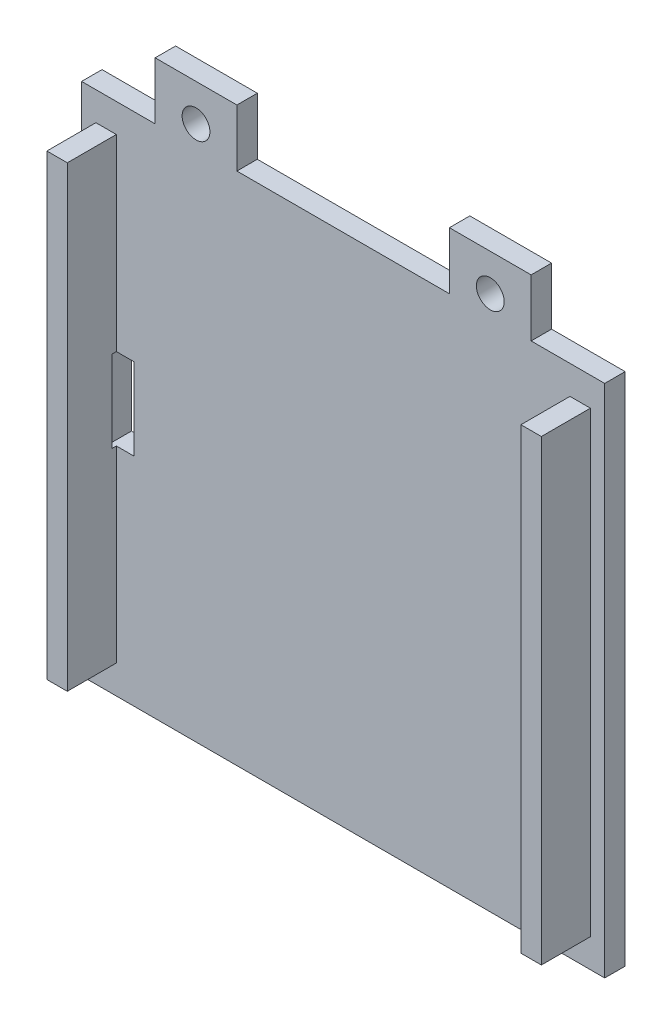
ISO-10303-21;
HEADER;
FILE_DESCRIPTION(('STEP AP214'),'2;1');
FILE_NAME('part.step','',(''),(''),'','','');
FILE_SCHEMA(('AUTOMOTIVE_DESIGN { 1 0 10303 214 1 1 1 1 }'));
ENDSEC;
DATA;
#1=APPLICATION_CONTEXT('core data for automotive mechanical design processes');
#2=APPLICATION_PROTOCOL_DEFINITION('international standard','automotive_design',2000,#1);
#3=PRODUCT_CONTEXT('',#1,'mechanical');
#4=PRODUCT('Part','Part','',(#3));
#5=PRODUCT_RELATED_PRODUCT_CATEGORY('part','',(#4));
#6=PRODUCT_DEFINITION_FORMATION('','',#4);
#7=PRODUCT_DEFINITION_CONTEXT('part definition',#1,'design');
#8=PRODUCT_DEFINITION('design','',#6,#7);
#9=PRODUCT_DEFINITION_SHAPE('','',#8);
#10=(LENGTH_UNIT() NAMED_UNIT(*) SI_UNIT(.MILLI.,.METRE.));
#11=(NAMED_UNIT(*) PLANE_ANGLE_UNIT() SI_UNIT($,.RADIAN.));
#12=(NAMED_UNIT(*) SI_UNIT($,.STERADIAN.) SOLID_ANGLE_UNIT());
#13=UNCERTAINTY_MEASURE_WITH_UNIT(LENGTH_MEASURE(1.E-05),#10,'distance_accuracy_value','');
#14=(GEOMETRIC_REPRESENTATION_CONTEXT(3) GLOBAL_UNCERTAINTY_ASSIGNED_CONTEXT((#13)) GLOBAL_UNIT_ASSIGNED_CONTEXT((#10,
#11,#12)) REPRESENTATION_CONTEXT('',''));
#15=CARTESIAN_POINT('',(0.,0.,0.));
#16=DIRECTION('',(0.,0.,1.));
#17=DIRECTION('',(1.,0.,0.));
#18=AXIS2_PLACEMENT_3D('',#15,#16,#17);
#19=CARTESIAN_POINT('',(0.,0.,2.5));
#20=DIRECTION('',(0.,0.,-1.));
#21=DIRECTION('',(-1.,0.,0.));
#22=AXIS2_PLACEMENT_3D('',#19,#20,#21);
#23=PLANE('',#22);
#24=CARTESIAN_POINT('',(-18.,34.,2.5));
#25=DIRECTION('',(0.,0.,-1.));
#26=DIRECTION('',(-1.,0.,0.));
#27=AXIS2_PLACEMENT_3D('',#24,#25,#26);
#28=CIRCLE('',#27,1.7);
#29=CARTESIAN_POINT('',(-19.7,34.,2.5));
#30=VERTEX_POINT('',#29);
#31=EDGE_CURVE('E289',#30,#30,#28,.F.);
#32=ORIENTED_EDGE('',*,*,#31,.F.);
#33=EDGE_LOOP('',(#32));
#34=FACE_BOUND('',#33,.T.);
#35=CARTESIAN_POINT('',(18.,34.,2.5));
#36=DIRECTION('',(0.,0.,-1.));
#37=DIRECTION('',(-1.,0.,0.));
#38=AXIS2_PLACEMENT_3D('',#35,#36,#37);
#39=CIRCLE('',#38,1.7);
#40=CARTESIAN_POINT('',(16.3,34.,2.5));
#41=VERTEX_POINT('',#40);
#42=EDGE_CURVE('E499',#41,#41,#39,.F.);
#43=ORIENTED_EDGE('',*,*,#42,.F.);
#44=EDGE_LOOP('',(#43));
#45=FACE_BOUND('',#44,.T.);
#46=DIRECTION('',(1.,0.,0.));
#47=VECTOR('',#46,1.);
#48=CARTESIAN_POINT('',(0.,-5.,2.5));
#49=LINE('',#48,#47);
#50=CARTESIAN_POINT('',(25.6,-5.,2.5));
#51=VERTEX_POINT('',#50);
#52=CARTESIAN_POINT('',(27.75,-5.,2.5));
#53=VERTEX_POINT('',#52);
#54=EDGE_CURVE('E307',#51,#53,#49,.T.);
#55=ORIENTED_EDGE('',*,*,#54,.F.);
#56=DIRECTION('',(0.,-1.,0.));
#57=VECTOR('',#56,1.);
#58=CARTESIAN_POINT('',(25.6,0.,2.5));
#59=LINE('',#58,#57);
#60=CARTESIAN_POINT('',(25.6,5.,2.5));
#61=VERTEX_POINT('',#60);
#62=EDGE_CURVE('E321',#61,#51,#59,.T.);
#63=ORIENTED_EDGE('',*,*,#62,.F.);
#64=DIRECTION('',(-1.,0.,0.));
#65=VECTOR('',#64,1.);
#66=CARTESIAN_POINT('',(0.,5.,2.5));
#67=LINE('',#66,#65);
#68=CARTESIAN_POINT('',(27.75,5.,2.5));
#69=VERTEX_POINT('',#68);
#70=EDGE_CURVE('E284',#69,#61,#67,.T.);
#71=ORIENTED_EDGE('',*,*,#70,.F.);
#72=DIRECTION('',(0.,-1.,0.));
#73=VECTOR('',#72,1.);
#74=CARTESIAN_POINT('',(27.75,-28.,2.5));
#75=LINE('',#74,#73);
#76=CARTESIAN_POINT('',(27.75,28.,2.5));
#77=VERTEX_POINT('',#76);
#78=EDGE_CURVE('E338',#77,#69,#75,.T.);
#79=ORIENTED_EDGE('',*,*,#78,.F.);
#80=DIRECTION('',(-1.,0.,0.));
#81=VECTOR('',#80,1.);
#82=CARTESIAN_POINT('',(27.75,28.,2.5));
#83=LINE('',#82,#81);
#84=CARTESIAN_POINT('',(30.25,28.,2.5));
#85=VERTEX_POINT('',#84);
#86=EDGE_CURVE('E341',#85,#77,#83,.T.);
#87=ORIENTED_EDGE('',*,*,#86,.F.);
#88=DIRECTION('',(0.,1.,0.));
#89=VECTOR('',#88,1.);
#90=CARTESIAN_POINT('',(30.25,28.,2.5));
#91=LINE('',#90,#89);
#92=CARTESIAN_POINT('',(30.25,-28.,2.5));
#93=VERTEX_POINT('',#92);
#94=EDGE_CURVE('E345',#93,#85,#91,.T.);
#95=ORIENTED_EDGE('',*,*,#94,.F.);
#96=DIRECTION('',(1.,0.,0.));
#97=VECTOR('',#96,1.);
#98=CARTESIAN_POINT('',(30.25,-28.,2.5));
#99=LINE('',#98,#97);
#100=CARTESIAN_POINT('',(27.75,-28.,2.5));
#101=VERTEX_POINT('',#100);
#102=EDGE_CURVE('E348',#101,#93,#99,.T.);
#103=ORIENTED_EDGE('',*,*,#102,.F.);
#104=EDGE_CURVE('E342',#53,#101,#75,.T.);
#105=ORIENTED_EDGE('',*,*,#104,.F.);
#106=EDGE_LOOP('',(#55,#63,#71,#79,#87,#95,#103,#105));
#107=FACE_BOUND('',#106,.T.);
#108=DIRECTION('',(-1.,0.,0.));
#109=VECTOR('',#108,1.);
#110=CARTESIAN_POINT('',(23.,31.5,2.5));
#111=LINE('',#110,#109);
#112=CARTESIAN_POINT('',(32.,31.5,2.5));
#113=VERTEX_POINT('',#112);
#114=CARTESIAN_POINT('',(23.,31.5,2.5));
#115=VERTEX_POINT('',#114);
#116=EDGE_CURVE('E394',#113,#115,#111,.T.);
#117=ORIENTED_EDGE('',*,*,#116,.T.);
#118=DIRECTION('',(0.,1.,0.));
#119=VECTOR('',#118,1.);
#120=CARTESIAN_POINT('',(23.,38.5,2.5));
#121=LINE('',#120,#119);
#122=CARTESIAN_POINT('',(23.,38.5,2.5));
#123=VERTEX_POINT('',#122);
#124=EDGE_CURVE('E397',#115,#123,#121,.T.);
#125=ORIENTED_EDGE('',*,*,#124,.T.);
#126=DIRECTION('',(-1.,0.,0.));
#127=VECTOR('',#126,1.);
#128=CARTESIAN_POINT('',(13.,38.5,2.5));
#129=LINE('',#128,#127);
#130=CARTESIAN_POINT('',(13.,38.5,2.5));
#131=VERTEX_POINT('',#130);
#132=EDGE_CURVE('E400',#123,#131,#129,.T.);
#133=ORIENTED_EDGE('',*,*,#132,.T.);
#134=DIRECTION('',(0.,-1.,0.));
#135=VECTOR('',#134,1.);
#136=CARTESIAN_POINT('',(13.,31.5,2.5));
#137=LINE('',#136,#135);
#138=CARTESIAN_POINT('',(13.,31.5,2.5));
#139=VERTEX_POINT('',#138);
#140=EDGE_CURVE('E402',#131,#139,#137,.T.);
#141=ORIENTED_EDGE('',*,*,#140,.T.);
#142=DIRECTION('',(-1.,0.,0.));
#143=VECTOR('',#142,1.);
#144=CARTESIAN_POINT('',(-13.,31.5,2.5));
#145=LINE('',#144,#143);
#146=CARTESIAN_POINT('',(-13.,31.5,2.5));
#147=VERTEX_POINT('',#146);
#148=EDGE_CURVE('E404',#139,#147,#145,.T.);
#149=ORIENTED_EDGE('',*,*,#148,.T.);
#150=DIRECTION('',(0.,1.,0.));
#151=VECTOR('',#150,1.);
#152=CARTESIAN_POINT('',(-13.,38.5,2.5));
#153=LINE('',#152,#151);
#154=CARTESIAN_POINT('',(-13.,38.5,2.5));
#155=VERTEX_POINT('',#154);
#156=EDGE_CURVE('E406',#147,#155,#153,.T.);
#157=ORIENTED_EDGE('',*,*,#156,.T.);
#158=DIRECTION('',(-1.,0.,0.));
#159=VECTOR('',#158,1.);
#160=CARTESIAN_POINT('',(-23.,38.5,2.5));
#161=LINE('',#160,#159);
#162=CARTESIAN_POINT('',(-23.,38.5,2.5));
#163=VERTEX_POINT('',#162);
#164=EDGE_CURVE('E408',#155,#163,#161,.T.);
#165=ORIENTED_EDGE('',*,*,#164,.T.);
#166=DIRECTION('',(0.,-1.,0.));
#167=VECTOR('',#166,1.);
#168=CARTESIAN_POINT('',(-23.,31.5,2.5));
#169=LINE('',#168,#167);
#170=CARTESIAN_POINT('',(-23.,31.5,2.5));
#171=VERTEX_POINT('',#170);
#172=EDGE_CURVE('E410',#163,#171,#169,.T.);
#173=ORIENTED_EDGE('',*,*,#172,.T.);
#174=DIRECTION('',(-1.,0.,0.));
#175=VECTOR('',#174,1.);
#176=CARTESIAN_POINT('',(-32.,31.5,2.5));
#177=LINE('',#176,#175);
#178=CARTESIAN_POINT('',(-32.,31.5,2.5));
#179=VERTEX_POINT('',#178);
#180=EDGE_CURVE('E412',#171,#179,#177,.T.);
#181=ORIENTED_EDGE('',*,*,#180,.T.);
#182=DIRECTION('',(0.,-1.,0.));
#183=VECTOR('',#182,1.);
#184=CARTESIAN_POINT('',(-32.,-31.5,2.5));
#185=LINE('',#184,#183);
#186=CARTESIAN_POINT('',(-32.,-31.5,2.5));
#187=VERTEX_POINT('',#186);
#188=EDGE_CURVE('E414',#179,#187,#185,.T.);
#189=ORIENTED_EDGE('',*,*,#188,.T.);
#190=DIRECTION('',(1.,0.,0.));
#191=VECTOR('',#190,1.);
#192=CARTESIAN_POINT('',(32.,-31.5,2.5));
#193=LINE('',#192,#191);
#194=CARTESIAN_POINT('',(32.,-31.5,2.5));
#195=VERTEX_POINT('',#194);
#196=EDGE_CURVE('E416',#187,#195,#193,.T.);
#197=ORIENTED_EDGE('',*,*,#196,.T.);
#198=DIRECTION('',(0.,1.,0.));
#199=VECTOR('',#198,1.);
#200=CARTESIAN_POINT('',(32.,31.5,2.5));
#201=LINE('',#200,#199);
#202=EDGE_CURVE('E418',#195,#113,#201,.T.);
#203=ORIENTED_EDGE('',*,*,#202,.T.);
#204=EDGE_LOOP('',(#117,#125,#133,#141,#149,#157,#165,#173,#181,#189,#197,#203));
#205=FACE_BOUND('',#204,.T.);
#206=DIRECTION('',(1.,0.,0.));
#207=VECTOR('',#206,1.);
#208=CARTESIAN_POINT('',(0.,-5.,2.5));
#209=LINE('',#208,#207);
#210=CARTESIAN_POINT('',(-27.75,-5.,2.5));
#211=VERTEX_POINT('',#210);
#212=CARTESIAN_POINT('',(-25.6,-5.,2.5));
#213=VERTEX_POINT('',#212);
#214=EDGE_CURVE('E316',#211,#213,#209,.T.);
#215=ORIENTED_EDGE('',*,*,#214,.F.);
#216=DIRECTION('',(0.,1.,0.));
#217=VECTOR('',#216,1.);
#218=CARTESIAN_POINT('',(-27.75,28.,2.5));
#219=LINE('',#218,#217);
#220=CARTESIAN_POINT('',(-27.75,-28.,2.5));
#221=VERTEX_POINT('',#220);
#222=EDGE_CURVE('E374',#221,#211,#219,.T.);
#223=ORIENTED_EDGE('',*,*,#222,.F.);
#224=DIRECTION('',(1.,0.,0.));
#225=VECTOR('',#224,1.);
#226=CARTESIAN_POINT('',(-27.75,-28.,2.5));
#227=LINE('',#226,#225);
#228=CARTESIAN_POINT('',(-30.25,-28.,2.5));
#229=VERTEX_POINT('',#228);
#230=EDGE_CURVE('E351',#229,#221,#227,.T.);
#231=ORIENTED_EDGE('',*,*,#230,.F.);
#232=DIRECTION('',(0.,-1.,0.));
#233=VECTOR('',#232,1.);
#234=CARTESIAN_POINT('',(-30.25,-28.,2.5));
#235=LINE('',#234,#233);
#236=CARTESIAN_POINT('',(-30.25,28.,2.5));
#237=VERTEX_POINT('',#236);
#238=EDGE_CURVE('E364',#237,#229,#235,.T.);
#239=ORIENTED_EDGE('',*,*,#238,.F.);
#240=DIRECTION('',(-1.,0.,0.));
#241=VECTOR('',#240,1.);
#242=CARTESIAN_POINT('',(-30.25,28.,2.5));
#243=LINE('',#242,#241);
#244=CARTESIAN_POINT('',(-27.75,28.,2.5));
#245=VERTEX_POINT('',#244);
#246=EDGE_CURVE('E377',#245,#237,#243,.T.);
#247=ORIENTED_EDGE('',*,*,#246,.F.);
#248=CARTESIAN_POINT('',(-27.75,5.,2.5));
#249=VERTEX_POINT('',#248);
#250=EDGE_CURVE('E373',#249,#245,#219,.T.);
#251=ORIENTED_EDGE('',*,*,#250,.F.);
#252=DIRECTION('',(-1.,0.,0.));
#253=VECTOR('',#252,1.);
#254=CARTESIAN_POINT('',(0.,5.,2.5));
#255=LINE('',#254,#253);
#256=CARTESIAN_POINT('',(-25.6,5.,2.5));
#257=VERTEX_POINT('',#256);
#258=EDGE_CURVE('E312',#257,#249,#255,.T.);
#259=ORIENTED_EDGE('',*,*,#258,.F.);
#260=DIRECTION('',(0.,1.,0.));
#261=VECTOR('',#260,1.);
#262=CARTESIAN_POINT('',(-25.6,0.,2.5));
#263=LINE('',#262,#261);
#264=EDGE_CURVE('E323',#213,#257,#263,.T.);
#265=ORIENTED_EDGE('',*,*,#264,.F.);
#266=EDGE_LOOP('',(#215,#223,#231,#239,#247,#251,#259,#265));
#267=FACE_BOUND('',#266,.T.);
#268=ADVANCED_FACE('F43',(#34,#45,#107,#205,#267),#23,.F.);
#269=CARTESIAN_POINT('',(0.,0.,0.));
#270=DIRECTION('',(0.,0.,-1.));
#271=DIRECTION('',(-1.,0.,0.));
#272=AXIS2_PLACEMENT_3D('',#269,#270,#271);
#273=PLANE('',#272);
#274=CARTESIAN_POINT('',(-18.,34.,0.));
#275=DIRECTION('',(0.,0.,-1.));
#276=DIRECTION('',(-1.,0.,0.));
#277=AXIS2_PLACEMENT_3D('',#274,#275,#276);
#278=CIRCLE('',#277,1.7);
#279=CARTESIAN_POINT('',(-19.7,34.,0.));
#280=VERTEX_POINT('',#279);
#281=EDGE_CURVE('E47',#280,#280,#278,.F.);
#282=ORIENTED_EDGE('',*,*,#281,.T.);
#283=EDGE_LOOP('',(#282));
#284=FACE_BOUND('',#283,.T.);
#285=CARTESIAN_POINT('',(18.,34.,0.));
#286=DIRECTION('',(0.,0.,-1.));
#287=DIRECTION('',(-1.,0.,0.));
#288=AXIS2_PLACEMENT_3D('',#285,#286,#287);
#289=CIRCLE('',#288,1.7);
#290=CARTESIAN_POINT('',(16.3,34.,0.));
#291=VERTEX_POINT('',#290);
#292=EDGE_CURVE('E497',#291,#291,#289,.F.);
#293=ORIENTED_EDGE('',*,*,#292,.T.);
#294=EDGE_LOOP('',(#293));
#295=FACE_BOUND('',#294,.T.);
#296=DIRECTION('',(-1.,0.,0.));
#297=VECTOR('',#296,1.);
#298=CARTESIAN_POINT('',(23.,31.5,0.));
#299=LINE('',#298,#297);
#300=CARTESIAN_POINT('',(32.,31.5,0.));
#301=VERTEX_POINT('',#300);
#302=CARTESIAN_POINT('',(23.,31.5,0.));
#303=VERTEX_POINT('',#302);
#304=EDGE_CURVE('E393',#301,#303,#299,.T.);
#305=ORIENTED_EDGE('',*,*,#304,.F.);
#306=DIRECTION('',(0.,1.,0.));
#307=VECTOR('',#306,1.);
#308=CARTESIAN_POINT('',(32.,31.5,0.));
#309=LINE('',#308,#307);
#310=CARTESIAN_POINT('',(32.,-31.5,0.));
#311=VERTEX_POINT('',#310);
#312=EDGE_CURVE('E398',#311,#301,#309,.T.);
#313=ORIENTED_EDGE('',*,*,#312,.F.);
#314=DIRECTION('',(1.,0.,0.));
#315=VECTOR('',#314,1.);
#316=CARTESIAN_POINT('',(32.,-31.5,0.));
#317=LINE('',#316,#315);
#318=CARTESIAN_POINT('',(-32.,-31.5,0.));
#319=VERTEX_POINT('',#318);
#320=EDGE_CURVE('E441',#319,#311,#317,.T.);
#321=ORIENTED_EDGE('',*,*,#320,.F.);
#322=DIRECTION('',(0.,-1.,0.));
#323=VECTOR('',#322,1.);
#324=CARTESIAN_POINT('',(-32.,-31.5,0.));
#325=LINE('',#324,#323);
#326=CARTESIAN_POINT('',(-32.,31.5,0.));
#327=VERTEX_POINT('',#326);
#328=EDGE_CURVE('E439',#327,#319,#325,.T.);
#329=ORIENTED_EDGE('',*,*,#328,.F.);
#330=DIRECTION('',(-1.,0.,0.));
#331=VECTOR('',#330,1.);
#332=CARTESIAN_POINT('',(-32.,31.5,0.));
#333=LINE('',#332,#331);
#334=CARTESIAN_POINT('',(-23.,31.5,0.));
#335=VERTEX_POINT('',#334);
#336=EDGE_CURVE('E437',#335,#327,#333,.T.);
#337=ORIENTED_EDGE('',*,*,#336,.F.);
#338=DIRECTION('',(0.,-1.,0.));
#339=VECTOR('',#338,1.);
#340=CARTESIAN_POINT('',(-23.,31.5,0.));
#341=LINE('',#340,#339);
#342=CARTESIAN_POINT('',(-23.,38.5,0.));
#343=VERTEX_POINT('',#342);
#344=EDGE_CURVE('E435',#343,#335,#341,.T.);
#345=ORIENTED_EDGE('',*,*,#344,.F.);
#346=DIRECTION('',(-1.,0.,0.));
#347=VECTOR('',#346,1.);
#348=CARTESIAN_POINT('',(-23.,38.5,0.));
#349=LINE('',#348,#347);
#350=CARTESIAN_POINT('',(-13.,38.5,0.));
#351=VERTEX_POINT('',#350);
#352=EDGE_CURVE('E433',#351,#343,#349,.T.);
#353=ORIENTED_EDGE('',*,*,#352,.F.);
#354=DIRECTION('',(0.,1.,0.));
#355=VECTOR('',#354,1.);
#356=CARTESIAN_POINT('',(-13.,38.5,0.));
#357=LINE('',#356,#355);
#358=CARTESIAN_POINT('',(-13.,31.5,0.));
#359=VERTEX_POINT('',#358);
#360=EDGE_CURVE('E431',#359,#351,#357,.T.);
#361=ORIENTED_EDGE('',*,*,#360,.F.);
#362=DIRECTION('',(-1.,0.,0.));
#363=VECTOR('',#362,1.);
#364=CARTESIAN_POINT('',(-13.,31.5,0.));
#365=LINE('',#364,#363);
#366=CARTESIAN_POINT('',(13.,31.5,0.));
#367=VERTEX_POINT('',#366);
#368=EDGE_CURVE('E429',#367,#359,#365,.T.);
#369=ORIENTED_EDGE('',*,*,#368,.F.);
#370=DIRECTION('',(0.,-1.,0.));
#371=VECTOR('',#370,1.);
#372=CARTESIAN_POINT('',(13.,31.5,0.));
#373=LINE('',#372,#371);
#374=CARTESIAN_POINT('',(13.,38.5,0.));
#375=VERTEX_POINT('',#374);
#376=EDGE_CURVE('E427',#375,#367,#373,.T.);
#377=ORIENTED_EDGE('',*,*,#376,.F.);
#378=DIRECTION('',(-1.,0.,0.));
#379=VECTOR('',#378,1.);
#380=CARTESIAN_POINT('',(13.,38.5,0.));
#381=LINE('',#380,#379);
#382=CARTESIAN_POINT('',(23.,38.5,0.));
#383=VERTEX_POINT('',#382);
#384=EDGE_CURVE('E425',#383,#375,#381,.T.);
#385=ORIENTED_EDGE('',*,*,#384,.F.);
#386=DIRECTION('',(0.,1.,0.));
#387=VECTOR('',#386,1.);
#388=CARTESIAN_POINT('',(23.,38.5,0.));
#389=LINE('',#388,#387);
#390=EDGE_CURVE('E423',#303,#383,#389,.T.);
#391=ORIENTED_EDGE('',*,*,#390,.F.);
#392=EDGE_LOOP('',(#305,#313,#321,#329,#337,#345,#353,#361,#369,#377,#385,#391));
#393=FACE_BOUND('',#392,.T.);
#394=DIRECTION('',(0.,-1.,0.));
#395=VECTOR('',#394,1.);
#396=CARTESIAN_POINT('',(25.6,0.,0.));
#397=LINE('',#396,#395);
#398=CARTESIAN_POINT('',(25.6,5.,0.));
#399=VERTEX_POINT('',#398);
#400=CARTESIAN_POINT('',(25.6,-5.,0.));
#401=VERTEX_POINT('',#400);
#402=EDGE_CURVE('E491',#399,#401,#397,.T.);
#403=ORIENTED_EDGE('',*,*,#402,.T.);
#404=DIRECTION('',(1.,0.,0.));
#405=VECTOR('',#404,1.);
#406=CARTESIAN_POINT('',(0.,-5.,0.));
#407=LINE('',#406,#405);
#408=CARTESIAN_POINT('',(28.4,-5.,0.));
#409=VERTEX_POINT('',#408);
#410=EDGE_CURVE('E309',#401,#409,#407,.T.);
#411=ORIENTED_EDGE('',*,*,#410,.T.);
#412=DIRECTION('',(0.,1.,0.));
#413=VECTOR('',#412,1.);
#414=CARTESIAN_POINT('',(28.4,0.,0.));
#415=LINE('',#414,#413);
#416=CARTESIAN_POINT('',(28.4,5.,0.));
#417=VERTEX_POINT('',#416);
#418=EDGE_CURVE('E494',#409,#417,#415,.T.);
#419=ORIENTED_EDGE('',*,*,#418,.T.);
#420=DIRECTION('',(-1.,0.,0.));
#421=VECTOR('',#420,1.);
#422=CARTESIAN_POINT('',(0.,5.,0.));
#423=LINE('',#422,#421);
#424=EDGE_CURVE('E304',#417,#399,#423,.T.);
#425=ORIENTED_EDGE('',*,*,#424,.T.);
#426=EDGE_LOOP('',(#403,#411,#419,#425));
#427=FACE_BOUND('',#426,.T.);
#428=DIRECTION('',(0.,-1.,0.));
#429=VECTOR('',#428,1.);
#430=CARTESIAN_POINT('',(-28.4,0.,0.));
#431=LINE('',#430,#429);
#432=CARTESIAN_POINT('',(-28.4,5.,0.));
#433=VERTEX_POINT('',#432);
#434=CARTESIAN_POINT('',(-28.4,-5.,0.));
#435=VERTEX_POINT('',#434);
#436=EDGE_CURVE('E52',#433,#435,#431,.T.);
#437=ORIENTED_EDGE('',*,*,#436,.T.);
#438=DIRECTION('',(1.,0.,0.));
#439=VECTOR('',#438,1.);
#440=CARTESIAN_POINT('',(0.,-5.,0.));
#441=LINE('',#440,#439);
#442=CARTESIAN_POINT('',(-25.6,-5.,0.));
#443=VERTEX_POINT('',#442);
#444=EDGE_CURVE('E318',#435,#443,#441,.T.);
#445=ORIENTED_EDGE('',*,*,#444,.T.);
#446=DIRECTION('',(0.,1.,0.));
#447=VECTOR('',#446,1.);
#448=CARTESIAN_POINT('',(-25.6,0.,0.));
#449=LINE('',#448,#447);
#450=CARTESIAN_POINT('',(-25.6,5.,0.));
#451=VERTEX_POINT('',#450);
#452=EDGE_CURVE('E11',#443,#451,#449,.T.);
#453=ORIENTED_EDGE('',*,*,#452,.T.);
#454=DIRECTION('',(-1.,0.,0.));
#455=VECTOR('',#454,1.);
#456=CARTESIAN_POINT('',(0.,5.,0.));
#457=LINE('',#456,#455);
#458=EDGE_CURVE('E314',#451,#433,#457,.T.);
#459=ORIENTED_EDGE('',*,*,#458,.T.);
#460=EDGE_LOOP('',(#437,#445,#453,#459));
#461=FACE_BOUND('',#460,.T.);
#462=ADVANCED_FACE('F523',(#284,#295,#393,#427,#461),#273,.T.);
#463=CARTESIAN_POINT('',(-27.75,28.,8.5));
#464=DIRECTION('',(-1.,0.,0.));
#465=DIRECTION('',(0.,0.,1.));
#466=AXIS2_PLACEMENT_3D('',#463,#464,#465);
#467=PLANE('',#466);
#468=DIRECTION('',(0.,0.,-1.));
#469=VECTOR('',#468,1.);
#470=CARTESIAN_POINT('',(-27.75,-5.,8.5));
#471=LINE('',#470,#469);
#472=CARTESIAN_POINT('',(-27.75,-5.,3.));
#473=VERTEX_POINT('',#472);
#474=EDGE_CURVE('E489',#473,#211,#471,.T.);
#475=ORIENTED_EDGE('',*,*,#474,.F.);
#476=DIRECTION('',(0.,-1.,0.));
#477=VECTOR('',#476,1.);
#478=CARTESIAN_POINT('',(-27.75,28.,3.));
#479=LINE('',#478,#477);
#480=CARTESIAN_POINT('',(-27.75,5.,3.));
#481=VERTEX_POINT('',#480);
#482=EDGE_CURVE('E486',#481,#473,#479,.T.);
#483=ORIENTED_EDGE('',*,*,#482,.F.);
#484=DIRECTION('',(0.,0.,1.));
#485=VECTOR('',#484,1.);
#486=CARTESIAN_POINT('',(-27.75,5.,8.5));
#487=LINE('',#486,#485);
#488=EDGE_CURVE('E261',#249,#481,#487,.T.);
#489=ORIENTED_EDGE('',*,*,#488,.F.);
#490=ORIENTED_EDGE('',*,*,#250,.T.);
#491=DIRECTION('',(0.,0.,-1.));
#492=VECTOR('',#491,1.);
#493=CARTESIAN_POINT('',(-27.75,28.,8.5));
#494=LINE('',#493,#492);
#495=CARTESIAN_POINT('',(-27.75,28.,8.5));
#496=VERTEX_POINT('',#495);
#497=EDGE_CURVE('E387',#496,#245,#494,.T.);
#498=ORIENTED_EDGE('',*,*,#497,.F.);
#499=DIRECTION('',(0.,1.,0.));
#500=VECTOR('',#499,1.);
#501=CARTESIAN_POINT('',(-27.75,28.,8.5));
#502=LINE('',#501,#500);
#503=CARTESIAN_POINT('',(-27.75,-28.,8.5));
#504=VERTEX_POINT('',#503);
#505=EDGE_CURVE('E363',#504,#496,#502,.T.);
#506=ORIENTED_EDGE('',*,*,#505,.F.);
#507=DIRECTION('',(0.,0.,-1.));
#508=VECTOR('',#507,1.);
#509=CARTESIAN_POINT('',(-27.75,-28.,8.5));
#510=LINE('',#509,#508);
#511=EDGE_CURVE('E390',#504,#221,#510,.T.);
#512=ORIENTED_EDGE('',*,*,#511,.T.);
#513=ORIENTED_EDGE('',*,*,#222,.T.);
#514=EDGE_LOOP('',(#475,#483,#489,#490,#498,#506,#512,#513));
#515=FACE_BOUND('',#514,.T.);
#516=ADVANCED_FACE('F514',(#515),#467,.F.);
#517=CARTESIAN_POINT('',(27.75,-28.,8.5));
#518=DIRECTION('',(1.,0.,0.));
#519=DIRECTION('',(0.,0.,-1.));
#520=AXIS2_PLACEMENT_3D('',#517,#518,#519);
#521=PLANE('',#520);
#522=DIRECTION('',(0.,0.,1.));
#523=VECTOR('',#522,1.);
#524=CARTESIAN_POINT('',(27.75,-5.,8.5));
#525=LINE('',#524,#523);
#526=CARTESIAN_POINT('',(27.75,-5.,3.));
#527=VERTEX_POINT('',#526);
#528=EDGE_CURVE('E483',#53,#527,#525,.T.);
#529=ORIENTED_EDGE('',*,*,#528,.F.);
#530=ORIENTED_EDGE('',*,*,#104,.T.);
#531=DIRECTION('',(0.,0.,-1.));
#532=VECTOR('',#531,1.);
#533=CARTESIAN_POINT('',(27.75,-28.,8.5));
#534=LINE('',#533,#532);
#535=CARTESIAN_POINT('',(27.75,-28.,8.5));
#536=VERTEX_POINT('',#535);
#537=EDGE_CURVE('E334',#536,#101,#534,.T.);
#538=ORIENTED_EDGE('',*,*,#537,.F.);
#539=DIRECTION('',(0.,-1.,0.));
#540=VECTOR('',#539,1.);
#541=CARTESIAN_POINT('',(27.75,-28.,8.5));
#542=LINE('',#541,#540);
#543=CARTESIAN_POINT('',(27.75,28.,8.5));
#544=VERTEX_POINT('',#543);
#545=EDGE_CURVE('E337',#544,#536,#542,.T.);
#546=ORIENTED_EDGE('',*,*,#545,.F.);
#547=DIRECTION('',(0.,0.,-1.));
#548=VECTOR('',#547,1.);
#549=CARTESIAN_POINT('',(27.75,28.,8.5));
#550=LINE('',#549,#548);
#551=EDGE_CURVE('E331',#544,#77,#550,.T.);
#552=ORIENTED_EDGE('',*,*,#551,.T.);
#553=ORIENTED_EDGE('',*,*,#78,.T.);
#554=DIRECTION('',(0.,0.,-1.));
#555=VECTOR('',#554,1.);
#556=CARTESIAN_POINT('',(27.75,5.,8.5));
#557=LINE('',#556,#555);
#558=CARTESIAN_POINT('',(27.75,5.,3.));
#559=VERTEX_POINT('',#558);
#560=EDGE_CURVE('E481',#559,#69,#557,.T.);
#561=ORIENTED_EDGE('',*,*,#560,.F.);
#562=DIRECTION('',(0.,1.,0.));
#563=VECTOR('',#562,1.);
#564=CARTESIAN_POINT('',(27.75,-28.,3.));
#565=LINE('',#564,#563);
#566=EDGE_CURVE('E479',#527,#559,#565,.T.);
#567=ORIENTED_EDGE('',*,*,#566,.F.);
#568=EDGE_LOOP('',(#529,#530,#538,#546,#552,#553,#561,#567));
#569=FACE_BOUND('',#568,.T.);
#570=ADVANCED_FACE('F608',(#569),#521,.F.);
#571=CARTESIAN_POINT('',(23.,31.5,2.5));
#572=DIRECTION('',(0.,-1.,0.));
#573=DIRECTION('',(0.,0.,-1.));
#574=AXIS2_PLACEMENT_3D('',#571,#572,#573);
#575=PLANE('',#574);
#576=ORIENTED_EDGE('',*,*,#304,.T.);
#577=DIRECTION('',(0.,0.,-1.));
#578=VECTOR('',#577,1.);
#579=CARTESIAN_POINT('',(23.,31.5,2.5));
#580=LINE('',#579,#578);
#581=EDGE_CURVE('E476',#115,#303,#580,.T.);
#582=ORIENTED_EDGE('',*,*,#581,.F.);
#583=ORIENTED_EDGE('',*,*,#116,.F.);
#584=DIRECTION('',(0.,0.,-1.));
#585=VECTOR('',#584,1.);
#586=CARTESIAN_POINT('',(32.,31.5,2.5));
#587=LINE('',#586,#585);
#588=EDGE_CURVE('E420',#113,#301,#587,.T.);
#589=ORIENTED_EDGE('',*,*,#588,.T.);
#590=EDGE_LOOP('',(#576,#582,#583,#589));
#591=FACE_BOUND('',#590,.T.);
#592=ADVANCED_FACE('F45',(#591),#575,.F.);
#593=CARTESIAN_POINT('',(23.,38.5,2.5));
#594=DIRECTION('',(-1.,0.,0.));
#595=DIRECTION('',(0.,0.,1.));
#596=AXIS2_PLACEMENT_3D('',#593,#594,#595);
#597=PLANE('',#596);
#598=ORIENTED_EDGE('',*,*,#390,.T.);
#599=DIRECTION('',(0.,0.,-1.));
#600=VECTOR('',#599,1.);
#601=CARTESIAN_POINT('',(23.,38.5,2.5));
#602=LINE('',#601,#600);
#603=EDGE_CURVE('E473',#123,#383,#602,.T.);
#604=ORIENTED_EDGE('',*,*,#603,.F.);
#605=ORIENTED_EDGE('',*,*,#124,.F.);
#606=ORIENTED_EDGE('',*,*,#581,.T.);
#607=EDGE_LOOP('',(#598,#604,#605,#606));
#608=FACE_BOUND('',#607,.T.);
#609=ADVANCED_FACE('F601',(#608),#597,.F.);
#610=CARTESIAN_POINT('',(13.,38.5,2.5));
#611=DIRECTION('',(0.,-1.,0.));
#612=DIRECTION('',(0.,0.,-1.));
#613=AXIS2_PLACEMENT_3D('',#610,#611,#612);
#614=PLANE('',#613);
#615=ORIENTED_EDGE('',*,*,#384,.T.);
#616=DIRECTION('',(0.,0.,-1.));
#617=VECTOR('',#616,1.);
#618=CARTESIAN_POINT('',(13.,38.5,2.5));
#619=LINE('',#618,#617);
#620=EDGE_CURVE('E470',#131,#375,#619,.T.);
#621=ORIENTED_EDGE('',*,*,#620,.F.);
#622=ORIENTED_EDGE('',*,*,#132,.F.);
#623=ORIENTED_EDGE('',*,*,#603,.T.);
#624=EDGE_LOOP('',(#615,#621,#622,#623));
#625=FACE_BOUND('',#624,.T.);
#626=ADVANCED_FACE('F598',(#625),#614,.F.);
#627=CARTESIAN_POINT('',(13.,31.5,2.5));
#628=DIRECTION('',(1.,0.,0.));
#629=DIRECTION('',(0.,0.,-1.));
#630=AXIS2_PLACEMENT_3D('',#627,#628,#629);
#631=PLANE('',#630);
#632=ORIENTED_EDGE('',*,*,#376,.T.);
#633=DIRECTION('',(0.,0.,-1.));
#634=VECTOR('',#633,1.);
#635=CARTESIAN_POINT('',(13.,31.5,2.5));
#636=LINE('',#635,#634);
#637=EDGE_CURVE('E467',#139,#367,#636,.T.);
#638=ORIENTED_EDGE('',*,*,#637,.F.);
#639=ORIENTED_EDGE('',*,*,#140,.F.);
#640=ORIENTED_EDGE('',*,*,#620,.T.);
#641=EDGE_LOOP('',(#632,#638,#639,#640));
#642=FACE_BOUND('',#641,.T.);
#643=ADVANCED_FACE('F594',(#642),#631,.F.);
#644=CARTESIAN_POINT('',(-13.,31.5,2.5));
#645=DIRECTION('',(0.,-1.,0.));
#646=DIRECTION('',(0.,0.,-1.));
#647=AXIS2_PLACEMENT_3D('',#644,#645,#646);
#648=PLANE('',#647);
#649=ORIENTED_EDGE('',*,*,#368,.T.);
#650=DIRECTION('',(0.,0.,-1.));
#651=VECTOR('',#650,1.);
#652=CARTESIAN_POINT('',(-13.,31.5,2.5));
#653=LINE('',#652,#651);
#654=EDGE_CURVE('E464',#147,#359,#653,.T.);
#655=ORIENTED_EDGE('',*,*,#654,.F.);
#656=ORIENTED_EDGE('',*,*,#148,.F.);
#657=ORIENTED_EDGE('',*,*,#637,.T.);
#658=EDGE_LOOP('',(#649,#655,#656,#657));
#659=FACE_BOUND('',#658,.T.);
#660=ADVANCED_FACE('F590',(#659),#648,.F.);
#661=CARTESIAN_POINT('',(-13.,38.5,2.5));
#662=DIRECTION('',(-1.,0.,0.));
#663=DIRECTION('',(0.,0.,1.));
#664=AXIS2_PLACEMENT_3D('',#661,#662,#663);
#665=PLANE('',#664);
#666=ORIENTED_EDGE('',*,*,#360,.T.);
#667=DIRECTION('',(0.,0.,-1.));
#668=VECTOR('',#667,1.);
#669=CARTESIAN_POINT('',(-13.,38.5,2.5));
#670=LINE('',#669,#668);
#671=EDGE_CURVE('E461',#155,#351,#670,.T.);
#672=ORIENTED_EDGE('',*,*,#671,.F.);
#673=ORIENTED_EDGE('',*,*,#156,.F.);
#674=ORIENTED_EDGE('',*,*,#654,.T.);
#675=EDGE_LOOP('',(#666,#672,#673,#674));
#676=FACE_BOUND('',#675,.T.);
#677=ADVANCED_FACE('F586',(#676),#665,.F.);
#678=CARTESIAN_POINT('',(-23.,38.5,2.5));
#679=DIRECTION('',(0.,-1.,0.));
#680=DIRECTION('',(0.,0.,-1.));
#681=AXIS2_PLACEMENT_3D('',#678,#679,#680);
#682=PLANE('',#681);
#683=ORIENTED_EDGE('',*,*,#352,.T.);
#684=DIRECTION('',(0.,0.,-1.));
#685=VECTOR('',#684,1.);
#686=CARTESIAN_POINT('',(-23.,38.5,2.5));
#687=LINE('',#686,#685);
#688=EDGE_CURVE('E458',#163,#343,#687,.T.);
#689=ORIENTED_EDGE('',*,*,#688,.F.);
#690=ORIENTED_EDGE('',*,*,#164,.F.);
#691=ORIENTED_EDGE('',*,*,#671,.T.);
#692=EDGE_LOOP('',(#683,#689,#690,#691));
#693=FACE_BOUND('',#692,.T.);
#694=ADVANCED_FACE('F582',(#693),#682,.F.);
#695=CARTESIAN_POINT('',(-23.,31.5,2.5));
#696=DIRECTION('',(1.,0.,0.));
#697=DIRECTION('',(0.,0.,-1.));
#698=AXIS2_PLACEMENT_3D('',#695,#696,#697);
#699=PLANE('',#698);
#700=ORIENTED_EDGE('',*,*,#344,.T.);
#701=DIRECTION('',(0.,0.,-1.));
#702=VECTOR('',#701,1.);
#703=CARTESIAN_POINT('',(-23.,31.5,2.5));
#704=LINE('',#703,#702);
#705=EDGE_CURVE('E455',#171,#335,#704,.T.);
#706=ORIENTED_EDGE('',*,*,#705,.F.);
#707=ORIENTED_EDGE('',*,*,#172,.F.);
#708=ORIENTED_EDGE('',*,*,#688,.T.);
#709=EDGE_LOOP('',(#700,#706,#707,#708));
#710=FACE_BOUND('',#709,.T.);
#711=ADVANCED_FACE('F578',(#710),#699,.F.);
#712=CARTESIAN_POINT('',(-32.,31.5,2.5));
#713=DIRECTION('',(0.,-1.,0.));
#714=DIRECTION('',(0.,0.,-1.));
#715=AXIS2_PLACEMENT_3D('',#712,#713,#714);
#716=PLANE('',#715);
#717=ORIENTED_EDGE('',*,*,#336,.T.);
#718=DIRECTION('',(0.,0.,-1.));
#719=VECTOR('',#718,1.);
#720=CARTESIAN_POINT('',(-32.,31.5,2.5));
#721=LINE('',#720,#719);
#722=EDGE_CURVE('E452',#179,#327,#721,.T.);
#723=ORIENTED_EDGE('',*,*,#722,.F.);
#724=ORIENTED_EDGE('',*,*,#180,.F.);
#725=ORIENTED_EDGE('',*,*,#705,.T.);
#726=EDGE_LOOP('',(#717,#723,#724,#725));
#727=FACE_BOUND('',#726,.T.);
#728=ADVANCED_FACE('F574',(#727),#716,.F.);
#729=CARTESIAN_POINT('',(-32.,-31.5,2.5));
#730=DIRECTION('',(1.,0.,0.));
#731=DIRECTION('',(0.,0.,-1.));
#732=AXIS2_PLACEMENT_3D('',#729,#730,#731);
#733=PLANE('',#732);
#734=ORIENTED_EDGE('',*,*,#328,.T.);
#735=DIRECTION('',(0.,0.,-1.));
#736=VECTOR('',#735,1.);
#737=CARTESIAN_POINT('',(-32.,-31.5,2.5));
#738=LINE('',#737,#736);
#739=EDGE_CURVE('E449',#187,#319,#738,.T.);
#740=ORIENTED_EDGE('',*,*,#739,.F.);
#741=ORIENTED_EDGE('',*,*,#188,.F.);
#742=ORIENTED_EDGE('',*,*,#722,.T.);
#743=EDGE_LOOP('',(#734,#740,#741,#742));
#744=FACE_BOUND('',#743,.T.);
#745=ADVANCED_FACE('F570',(#744),#733,.F.);
#746=CARTESIAN_POINT('',(32.,-31.5,2.5));
#747=DIRECTION('',(0.,1.,0.));
#748=DIRECTION('',(0.,0.,1.));
#749=AXIS2_PLACEMENT_3D('',#746,#747,#748);
#750=PLANE('',#749);
#751=ORIENTED_EDGE('',*,*,#320,.T.);
#752=DIRECTION('',(0.,0.,-1.));
#753=VECTOR('',#752,1.);
#754=CARTESIAN_POINT('',(32.,-31.5,2.5));
#755=LINE('',#754,#753);
#756=EDGE_CURVE('E446',#195,#311,#755,.T.);
#757=ORIENTED_EDGE('',*,*,#756,.F.);
#758=ORIENTED_EDGE('',*,*,#196,.F.);
#759=ORIENTED_EDGE('',*,*,#739,.T.);
#760=EDGE_LOOP('',(#751,#757,#758,#759));
#761=FACE_BOUND('',#760,.T.);
#762=ADVANCED_FACE('F566',(#761),#750,.F.);
#763=CARTESIAN_POINT('',(32.,31.5,2.5));
#764=DIRECTION('',(-1.,0.,0.));
#765=DIRECTION('',(0.,0.,1.));
#766=AXIS2_PLACEMENT_3D('',#763,#764,#765);
#767=PLANE('',#766);
#768=ORIENTED_EDGE('',*,*,#312,.T.);
#769=ORIENTED_EDGE('',*,*,#588,.F.);
#770=ORIENTED_EDGE('',*,*,#202,.F.);
#771=ORIENTED_EDGE('',*,*,#756,.T.);
#772=EDGE_LOOP('',(#768,#769,#770,#771));
#773=FACE_BOUND('',#772,.T.);
#774=ADVANCED_FACE('F563',(#773),#767,.F.);
#775=CARTESIAN_POINT('',(-27.75,-28.,8.5));
#776=DIRECTION('',(0.,1.,0.));
#777=DIRECTION('',(0.,0.,1.));
#778=AXIS2_PLACEMENT_3D('',#775,#776,#777);
#779=PLANE('',#778);
#780=ORIENTED_EDGE('',*,*,#230,.T.);
#781=ORIENTED_EDGE('',*,*,#511,.F.);
#782=DIRECTION('',(1.,0.,0.));
#783=VECTOR('',#782,1.);
#784=CARTESIAN_POINT('',(-27.75,-28.,8.5));
#785=LINE('',#784,#783);
#786=CARTESIAN_POINT('',(-30.25,-28.,8.5));
#787=VERTEX_POINT('',#786);
#788=EDGE_CURVE('E360',#787,#504,#785,.T.);
#789=ORIENTED_EDGE('',*,*,#788,.F.);
#790=DIRECTION('',(0.,0.,-1.));
#791=VECTOR('',#790,1.);
#792=CARTESIAN_POINT('',(-30.25,-28.,8.5));
#793=LINE('',#792,#791);
#794=EDGE_CURVE('E370',#787,#229,#793,.T.);
#795=ORIENTED_EDGE('',*,*,#794,.T.);
#796=EDGE_LOOP('',(#780,#781,#789,#795));
#797=FACE_BOUND('',#796,.T.);
#798=ADVANCED_FACE('F537',(#797),#779,.F.);
#799=CARTESIAN_POINT('',(-30.25,28.,8.5));
#800=DIRECTION('',(0.,-1.,0.));
#801=DIRECTION('',(0.,0.,-1.));
#802=AXIS2_PLACEMENT_3D('',#799,#800,#801);
#803=PLANE('',#802);
#804=ORIENTED_EDGE('',*,*,#246,.T.);
#805=DIRECTION('',(0.,0.,-1.));
#806=VECTOR('',#805,1.);
#807=CARTESIAN_POINT('',(-30.25,28.,8.5));
#808=LINE('',#807,#806);
#809=CARTESIAN_POINT('',(-30.25,28.,8.5));
#810=VERTEX_POINT('',#809);
#811=EDGE_CURVE('E384',#810,#237,#808,.T.);
#812=ORIENTED_EDGE('',*,*,#811,.F.);
#813=DIRECTION('',(-1.,0.,0.));
#814=VECTOR('',#813,1.);
#815=CARTESIAN_POINT('',(-30.25,28.,8.5));
#816=LINE('',#815,#814);
#817=EDGE_CURVE('E366',#496,#810,#816,.T.);
#818=ORIENTED_EDGE('',*,*,#817,.F.);
#819=ORIENTED_EDGE('',*,*,#497,.T.);
#820=EDGE_LOOP('',(#804,#812,#818,#819));
#821=FACE_BOUND('',#820,.T.);
#822=ADVANCED_FACE('F530',(#821),#803,.F.);
#823=CARTESIAN_POINT('',(-30.25,-28.,8.5));
#824=DIRECTION('',(1.,0.,0.));
#825=DIRECTION('',(0.,0.,-1.));
#826=AXIS2_PLACEMENT_3D('',#823,#824,#825);
#827=PLANE('',#826);
#828=ORIENTED_EDGE('',*,*,#238,.T.);
#829=ORIENTED_EDGE('',*,*,#794,.F.);
#830=DIRECTION('',(0.,-1.,0.));
#831=VECTOR('',#830,1.);
#832=CARTESIAN_POINT('',(-30.25,-28.,8.5));
#833=LINE('',#832,#831);
#834=EDGE_CURVE('E368',#810,#787,#833,.T.);
#835=ORIENTED_EDGE('',*,*,#834,.F.);
#836=ORIENTED_EDGE('',*,*,#811,.T.);
#837=EDGE_LOOP('',(#828,#829,#835,#836));
#838=FACE_BOUND('',#837,.T.);
#839=ADVANCED_FACE('F539',(#838),#827,.F.);
#840=CARTESIAN_POINT('',(0.,0.,8.5));
#841=DIRECTION('',(0.,0.,-1.));
#842=DIRECTION('',(-1.,0.,0.));
#843=AXIS2_PLACEMENT_3D('',#840,#841,#842);
#844=PLANE('',#843);
#845=ORIENTED_EDGE('',*,*,#788,.T.);
#846=ORIENTED_EDGE('',*,*,#505,.T.);
#847=ORIENTED_EDGE('',*,*,#817,.T.);
#848=ORIENTED_EDGE('',*,*,#834,.T.);
#849=EDGE_LOOP('',(#845,#846,#847,#848));
#850=FACE_BOUND('',#849,.T.);
#851=ADVANCED_FACE('F533',(#850),#844,.F.);
#852=CARTESIAN_POINT('',(30.25,-28.,8.5));
#853=DIRECTION('',(0.,1.,0.));
#854=DIRECTION('',(0.,0.,1.));
#855=AXIS2_PLACEMENT_3D('',#852,#853,#854);
#856=PLANE('',#855);
#857=ORIENTED_EDGE('',*,*,#102,.T.);
#858=DIRECTION('',(0.,0.,-1.));
#859=VECTOR('',#858,1.);
#860=CARTESIAN_POINT('',(30.25,-28.,8.5));
#861=LINE('',#860,#859);
#862=CARTESIAN_POINT('',(30.25,-28.,8.5));
#863=VERTEX_POINT('',#862);
#864=EDGE_CURVE('E325',#863,#93,#861,.T.);
#865=ORIENTED_EDGE('',*,*,#864,.F.);
#866=DIRECTION('',(1.,0.,0.));
#867=VECTOR('',#866,1.);
#868=CARTESIAN_POINT('',(30.25,-28.,8.5));
#869=LINE('',#868,#867);
#870=EDGE_CURVE('E357',#536,#863,#869,.T.);
#871=ORIENTED_EDGE('',*,*,#870,.F.);
#872=ORIENTED_EDGE('',*,*,#537,.T.);
#873=EDGE_LOOP('',(#857,#865,#871,#872));
#874=FACE_BOUND('',#873,.T.);
#875=ADVANCED_FACE('F546',(#874),#856,.F.);
#876=CARTESIAN_POINT('',(30.25,28.,8.5));
#877=DIRECTION('',(-1.,0.,0.));
#878=DIRECTION('',(0.,0.,1.));
#879=AXIS2_PLACEMENT_3D('',#876,#877,#878);
#880=PLANE('',#879);
#881=ORIENTED_EDGE('',*,*,#94,.T.);
#882=DIRECTION('',(0.,0.,-1.));
#883=VECTOR('',#882,1.);
#884=CARTESIAN_POINT('',(30.25,28.,8.5));
#885=LINE('',#884,#883);
#886=CARTESIAN_POINT('',(30.25,28.,8.5));
#887=VERTEX_POINT('',#886);
#888=EDGE_CURVE('E328',#887,#85,#885,.T.);
#889=ORIENTED_EDGE('',*,*,#888,.F.);
#890=DIRECTION('',(0.,1.,0.));
#891=VECTOR('',#890,1.);
#892=CARTESIAN_POINT('',(30.25,28.,8.5));
#893=LINE('',#892,#891);
#894=EDGE_CURVE('E355',#863,#887,#893,.T.);
#895=ORIENTED_EDGE('',*,*,#894,.F.);
#896=ORIENTED_EDGE('',*,*,#864,.T.);
#897=EDGE_LOOP('',(#881,#889,#895,#896));
#898=FACE_BOUND('',#897,.T.);
#899=ADVANCED_FACE('F669',(#898),#880,.F.);
#900=CARTESIAN_POINT('',(27.75,28.,8.5));
#901=DIRECTION('',(0.,-1.,0.));
#902=DIRECTION('',(0.,0.,-1.));
#903=AXIS2_PLACEMENT_3D('',#900,#901,#902);
#904=PLANE('',#903);
#905=ORIENTED_EDGE('',*,*,#86,.T.);
#906=ORIENTED_EDGE('',*,*,#551,.F.);
#907=DIRECTION('',(-1.,0.,0.));
#908=VECTOR('',#907,1.);
#909=CARTESIAN_POINT('',(27.75,28.,8.5));
#910=LINE('',#909,#908);
#911=EDGE_CURVE('E353',#887,#544,#910,.T.);
#912=ORIENTED_EDGE('',*,*,#911,.F.);
#913=ORIENTED_EDGE('',*,*,#888,.T.);
#914=EDGE_LOOP('',(#905,#906,#912,#913));
#915=FACE_BOUND('',#914,.T.);
#916=ADVANCED_FACE('F665',(#915),#904,.F.);
#917=CARTESIAN_POINT('',(0.,0.,8.5));
#918=DIRECTION('',(0.,0.,-1.));
#919=DIRECTION('',(-1.,0.,0.));
#920=AXIS2_PLACEMENT_3D('',#917,#918,#919);
#921=PLANE('',#920);
#922=ORIENTED_EDGE('',*,*,#870,.T.);
#923=ORIENTED_EDGE('',*,*,#894,.T.);
#924=ORIENTED_EDGE('',*,*,#911,.T.);
#925=ORIENTED_EDGE('',*,*,#545,.T.);
#926=EDGE_LOOP('',(#922,#923,#924,#925));
#927=FACE_BOUND('',#926,.T.);
#928=ADVANCED_FACE('F699',(#927),#921,.F.);
#929=CARTESIAN_POINT('',(25.6,-5.,3.));
#930=DIRECTION('',(1.,0.,0.));
#931=DIRECTION('',(0.,0.,-1.));
#932=AXIS2_PLACEMENT_3D('',#929,#930,#931);
#933=PLANE('',#932);
#934=ORIENTED_EDGE('',*,*,#62,.T.);
#935=DIRECTION('',(0.,0.,-1.));
#936=VECTOR('',#935,1.);
#937=CARTESIAN_POINT('',(25.6,-5.,3.));
#938=LINE('',#937,#936);
#939=EDGE_CURVE('E68',#51,#401,#938,.T.);
#940=ORIENTED_EDGE('',*,*,#939,.T.);
#941=ORIENTED_EDGE('',*,*,#402,.F.);
#942=DIRECTION('',(0.,0.,-1.));
#943=VECTOR('',#942,1.);
#944=CARTESIAN_POINT('',(25.6,5.,3.));
#945=LINE('',#944,#943);
#946=EDGE_CURVE('E292',#61,#399,#945,.T.);
#947=ORIENTED_EDGE('',*,*,#946,.F.);
#948=EDGE_LOOP('',(#934,#940,#941,#947));
#949=FACE_BOUND('',#948,.T.);
#950=ADVANCED_FACE('F648',(#949),#933,.T.);
#951=CARTESIAN_POINT('',(28.4,-5.,3.));
#952=DIRECTION('',(0.,1.,0.));
#953=DIRECTION('',(0.,0.,1.));
#954=AXIS2_PLACEMENT_3D('',#951,#952,#953);
#955=PLANE('',#954);
#956=ORIENTED_EDGE('',*,*,#939,.F.);
#957=ORIENTED_EDGE('',*,*,#54,.T.);
#958=ORIENTED_EDGE('',*,*,#528,.T.);
#959=DIRECTION('',(1.,0.,0.));
#960=VECTOR('',#959,1.);
#961=CARTESIAN_POINT('',(28.4,-5.,3.));
#962=LINE('',#961,#960);
#963=CARTESIAN_POINT('',(28.4,-5.,3.));
#964=VERTEX_POINT('',#963);
#965=EDGE_CURVE('E301',#527,#964,#962,.T.);
#966=ORIENTED_EDGE('',*,*,#965,.T.);
#967=DIRECTION('',(0.,0.,-1.));
#968=VECTOR('',#967,1.);
#969=CARTESIAN_POINT('',(28.4,-5.,3.));
#970=LINE('',#969,#968);
#971=EDGE_CURVE('E285',#964,#409,#970,.T.);
#972=ORIENTED_EDGE('',*,*,#971,.T.);
#973=ORIENTED_EDGE('',*,*,#410,.F.);
#974=EDGE_LOOP('',(#956,#957,#958,#966,#972,#973));
#975=FACE_BOUND('',#974,.T.);
#976=ADVANCED_FACE('F675',(#975),#955,.T.);
#977=CARTESIAN_POINT('',(25.6,5.,3.));
#978=DIRECTION('',(0.,-1.,0.));
#979=DIRECTION('',(0.,0.,-1.));
#980=AXIS2_PLACEMENT_3D('',#977,#978,#979);
#981=PLANE('',#980);
#982=DIRECTION('',(0.,0.,-1.));
#983=VECTOR('',#982,1.);
#984=CARTESIAN_POINT('',(28.4,5.,3.));
#985=LINE('',#984,#983);
#986=CARTESIAN_POINT('',(28.4,5.,3.));
#987=VERTEX_POINT('',#986);
#988=EDGE_CURVE('E288',#987,#417,#985,.T.);
#989=ORIENTED_EDGE('',*,*,#988,.F.);
#990=DIRECTION('',(-1.,0.,0.));
#991=VECTOR('',#990,1.);
#992=CARTESIAN_POINT('',(25.6,5.,3.));
#993=LINE('',#992,#991);
#994=EDGE_CURVE('E296',#987,#559,#993,.T.);
#995=ORIENTED_EDGE('',*,*,#994,.T.);
#996=ORIENTED_EDGE('',*,*,#560,.T.);
#997=ORIENTED_EDGE('',*,*,#70,.T.);
#998=ORIENTED_EDGE('',*,*,#946,.T.);
#999=ORIENTED_EDGE('',*,*,#424,.F.);
#1000=EDGE_LOOP('',(#989,#995,#996,#997,#998,#999));
#1001=FACE_BOUND('',#1000,.T.);
#1002=ADVANCED_FACE('F652',(#1001),#981,.T.);
#1003=CARTESIAN_POINT('',(0.,0.,3.));
#1004=DIRECTION('',(0.,0.,-1.));
#1005=DIRECTION('',(-1.,0.,0.));
#1006=AXIS2_PLACEMENT_3D('',#1003,#1004,#1005);
#1007=PLANE('',#1006);
#1008=ORIENTED_EDGE('',*,*,#566,.T.);
#1009=ORIENTED_EDGE('',*,*,#994,.F.);
#1010=DIRECTION('',(0.,1.,0.));
#1011=VECTOR('',#1010,1.);
#1012=CARTESIAN_POINT('',(28.4,5.,3.));
#1013=LINE('',#1012,#1011);
#1014=EDGE_CURVE('E299',#964,#987,#1013,.T.);
#1015=ORIENTED_EDGE('',*,*,#1014,.F.);
#1016=ORIENTED_EDGE('',*,*,#965,.F.);
#1017=EDGE_LOOP('',(#1008,#1009,#1015,#1016));
#1018=FACE_BOUND('',#1017,.T.);
#1019=ADVANCED_FACE('F682',(#1018),#1007,.T.);
#1020=CARTESIAN_POINT('',(28.4,5.,3.));
#1021=DIRECTION('',(-1.,0.,0.));
#1022=DIRECTION('',(0.,0.,1.));
#1023=AXIS2_PLACEMENT_3D('',#1020,#1021,#1022);
#1024=PLANE('',#1023);
#1025=ORIENTED_EDGE('',*,*,#971,.F.);
#1026=ORIENTED_EDGE('',*,*,#1014,.T.);
#1027=ORIENTED_EDGE('',*,*,#988,.T.);
#1028=ORIENTED_EDGE('',*,*,#418,.F.);
#1029=EDGE_LOOP('',(#1025,#1026,#1027,#1028));
#1030=FACE_BOUND('',#1029,.T.);
#1031=ADVANCED_FACE('F679',(#1030),#1024,.T.);
#1032=CARTESIAN_POINT('',(-25.6,5.,3.));
#1033=DIRECTION('',(-1.,0.,0.));
#1034=DIRECTION('',(0.,0.,1.));
#1035=AXIS2_PLACEMENT_3D('',#1032,#1033,#1034);
#1036=PLANE('',#1035);
#1037=ORIENTED_EDGE('',*,*,#264,.T.);
#1038=DIRECTION('',(0.,0.,-1.));
#1039=VECTOR('',#1038,1.);
#1040=CARTESIAN_POINT('',(-25.6,5.,3.));
#1041=LINE('',#1040,#1039);
#1042=EDGE_CURVE('E270',#257,#451,#1041,.T.);
#1043=ORIENTED_EDGE('',*,*,#1042,.T.);
#1044=ORIENTED_EDGE('',*,*,#452,.F.);
#1045=DIRECTION('',(0.,0.,-1.));
#1046=VECTOR('',#1045,1.);
#1047=CARTESIAN_POINT('',(-25.6,-5.,3.));
#1048=LINE('',#1047,#1046);
#1049=EDGE_CURVE('E281',#213,#443,#1048,.T.);
#1050=ORIENTED_EDGE('',*,*,#1049,.F.);
#1051=EDGE_LOOP('',(#1037,#1043,#1044,#1050));
#1052=FACE_BOUND('',#1051,.T.);
#1053=ADVANCED_FACE('F521',(#1052),#1036,.T.);
#1054=CARTESIAN_POINT('',(-25.6,-5.,3.));
#1055=DIRECTION('',(0.,1.,0.));
#1056=DIRECTION('',(0.,0.,1.));
#1057=AXIS2_PLACEMENT_3D('',#1054,#1055,#1056);
#1058=PLANE('',#1057);
#1059=DIRECTION('',(0.,0.,-1.));
#1060=VECTOR('',#1059,1.);
#1061=CARTESIAN_POINT('',(-28.4,-5.,3.));
#1062=LINE('',#1061,#1060);
#1063=CARTESIAN_POINT('',(-28.4,-5.,3.));
#1064=VERTEX_POINT('',#1063);
#1065=EDGE_CURVE('E60',#1064,#435,#1062,.T.);
#1066=ORIENTED_EDGE('',*,*,#1065,.F.);
#1067=DIRECTION('',(1.,0.,0.));
#1068=VECTOR('',#1067,1.);
#1069=CARTESIAN_POINT('',(-25.6,-5.,3.));
#1070=LINE('',#1069,#1068);
#1071=EDGE_CURVE('E266',#1064,#473,#1070,.T.);
#1072=ORIENTED_EDGE('',*,*,#1071,.T.);
#1073=ORIENTED_EDGE('',*,*,#474,.T.);
#1074=ORIENTED_EDGE('',*,*,#214,.T.);
#1075=ORIENTED_EDGE('',*,*,#1049,.T.);
#1076=ORIENTED_EDGE('',*,*,#444,.F.);
#1077=EDGE_LOOP('',(#1066,#1072,#1073,#1074,#1075,#1076));
#1078=FACE_BOUND('',#1077,.T.);
#1079=ADVANCED_FACE('F511',(#1078),#1058,.T.);
#1080=CARTESIAN_POINT('',(-28.4,5.,3.));
#1081=DIRECTION('',(0.,-1.,0.));
#1082=DIRECTION('',(0.,0.,-1.));
#1083=AXIS2_PLACEMENT_3D('',#1080,#1081,#1082);
#1084=PLANE('',#1083);
#1085=ORIENTED_EDGE('',*,*,#1042,.F.);
#1086=ORIENTED_EDGE('',*,*,#258,.T.);
#1087=ORIENTED_EDGE('',*,*,#488,.T.);
#1088=DIRECTION('',(-1.,0.,0.));
#1089=VECTOR('',#1088,1.);
#1090=CARTESIAN_POINT('',(-28.4,5.,3.));
#1091=LINE('',#1090,#1089);
#1092=CARTESIAN_POINT('',(-28.4,5.,3.));
#1093=VERTEX_POINT('',#1092);
#1094=EDGE_CURVE('E254',#481,#1093,#1091,.T.);
#1095=ORIENTED_EDGE('',*,*,#1094,.T.);
#1096=DIRECTION('',(0.,0.,-1.));
#1097=VECTOR('',#1096,1.);
#1098=CARTESIAN_POINT('',(-28.4,5.,3.));
#1099=LINE('',#1098,#1097);
#1100=EDGE_CURVE('E258',#1093,#433,#1099,.T.);
#1101=ORIENTED_EDGE('',*,*,#1100,.T.);
#1102=ORIENTED_EDGE('',*,*,#458,.F.);
#1103=EDGE_LOOP('',(#1085,#1086,#1087,#1095,#1101,#1102));
#1104=FACE_BOUND('',#1103,.T.);
#1105=ADVANCED_FACE('F257',(#1104),#1084,.T.);
#1106=CARTESIAN_POINT('',(0.,0.,3.));
#1107=DIRECTION('',(0.,0.,-1.));
#1108=DIRECTION('',(-1.,0.,0.));
#1109=AXIS2_PLACEMENT_3D('',#1106,#1107,#1108);
#1110=PLANE('',#1109);
#1111=ORIENTED_EDGE('',*,*,#482,.T.);
#1112=ORIENTED_EDGE('',*,*,#1071,.F.);
#1113=DIRECTION('',(0.,-1.,0.));
#1114=VECTOR('',#1113,1.);
#1115=CARTESIAN_POINT('',(-28.4,-5.,3.));
#1116=LINE('',#1115,#1114);
#1117=EDGE_CURVE('E265',#1093,#1064,#1116,.T.);
#1118=ORIENTED_EDGE('',*,*,#1117,.F.);
#1119=ORIENTED_EDGE('',*,*,#1094,.F.);
#1120=EDGE_LOOP('',(#1111,#1112,#1118,#1119));
#1121=FACE_BOUND('',#1120,.T.);
#1122=ADVANCED_FACE('F273',(#1121),#1110,.T.);
#1123=CARTESIAN_POINT('',(-28.4,-5.,3.));
#1124=DIRECTION('',(1.,0.,0.));
#1125=DIRECTION('',(0.,0.,-1.));
#1126=AXIS2_PLACEMENT_3D('',#1123,#1124,#1125);
#1127=PLANE('',#1126);
#1128=ORIENTED_EDGE('',*,*,#1100,.F.);
#1129=ORIENTED_EDGE('',*,*,#1117,.T.);
#1130=ORIENTED_EDGE('',*,*,#1065,.T.);
#1131=ORIENTED_EDGE('',*,*,#436,.F.);
#1132=EDGE_LOOP('',(#1128,#1129,#1130,#1131));
#1133=FACE_BOUND('',#1132,.T.);
#1134=ADVANCED_FACE('F268',(#1133),#1127,.T.);
#1135=CARTESIAN_POINT('',(18.,34.,4.));
#1136=DIRECTION('',(0.,0.,-1.));
#1137=DIRECTION('',(-1.,0.,0.));
#1138=AXIS2_PLACEMENT_3D('',#1135,#1136,#1137);
#1139=CYLINDRICAL_SURFACE('',#1138,1.7);
#1140=ORIENTED_EDGE('',*,*,#292,.F.);
#1141=EDGE_LOOP('',(#1140));
#1142=FACE_BOUND('',#1141,.T.);
#1143=ORIENTED_EDGE('',*,*,#42,.T.);
#1144=EDGE_LOOP('',(#1143));
#1145=FACE_BOUND('',#1144,.T.);
#1146=ADVANCED_FACE('F722',(#1142,#1145),#1139,.F.);
#1147=CARTESIAN_POINT('',(-18.,34.,4.));
#1148=DIRECTION('',(0.,0.,-1.));
#1149=DIRECTION('',(-1.,0.,0.));
#1150=AXIS2_PLACEMENT_3D('',#1147,#1148,#1149);
#1151=CYLINDRICAL_SURFACE('',#1150,1.7);
#1152=ORIENTED_EDGE('',*,*,#281,.F.);
#1153=EDGE_LOOP('',(#1152));
#1154=FACE_BOUND('',#1153,.T.);
#1155=ORIENTED_EDGE('',*,*,#31,.T.);
#1156=EDGE_LOOP('',(#1155));
#1157=FACE_BOUND('',#1156,.T.);
#1158=ADVANCED_FACE('F727',(#1154,#1157),#1151,.F.);
#1159=CLOSED_SHELL('',(#268,#462,#516,#570,#592,#609,#626,#643,#660,#677,#694,#711,#728,#745,
#762,#774,#798,#822,#839,#851,#875,#899,#916,#928,#950,#976,#1002,#1019,#1031,#1053,#1079,#1105,
#1122,#1134,#1146,#1158));
#1160=MANIFOLD_SOLID_BREP('B2',#1159);
#1161=ADVANCED_BREP_SHAPE_REPRESENTATION('',(#18,#1160),#14);
#1162=SHAPE_DEFINITION_REPRESENTATION(#9,#1161);
ENDSEC;
END-ISO-10303-21;
